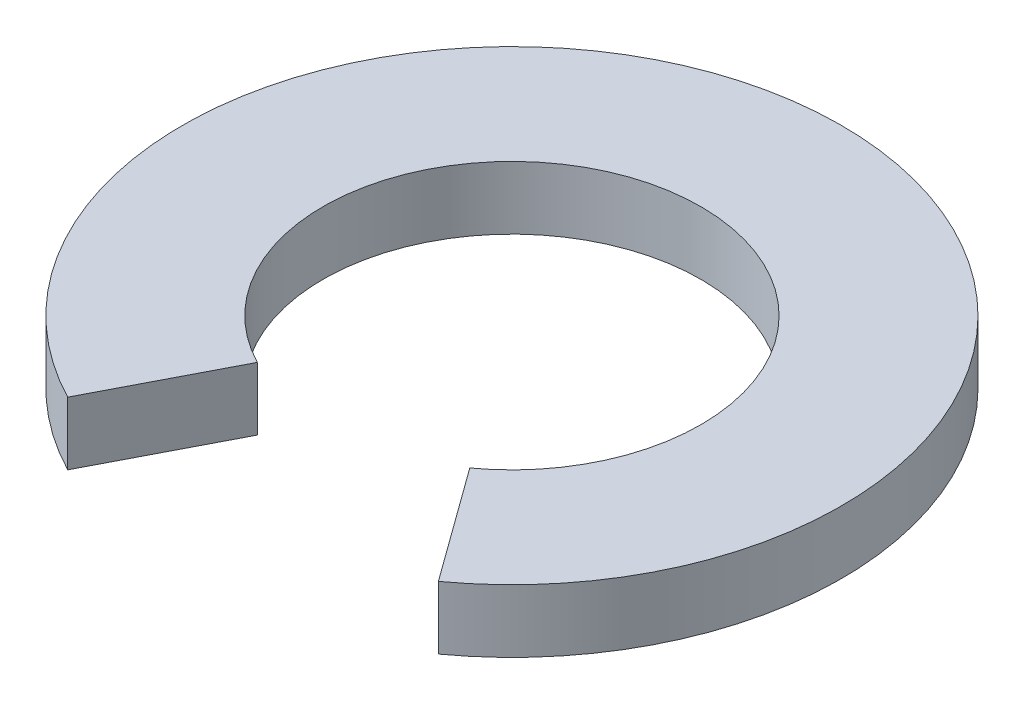
ISO-10303-21;
HEADER;
FILE_DESCRIPTION(('STEP AP214'),'2;1');
FILE_NAME('part.step','',(''),(''),'','','');
FILE_SCHEMA(('AUTOMOTIVE_DESIGN { 1 0 10303 214 1 1 1 1 }'));
ENDSEC;
DATA;
#1=APPLICATION_CONTEXT('core data for automotive mechanical design processes');
#2=APPLICATION_PROTOCOL_DEFINITION('international standard','automotive_design',2000,#1);
#3=PRODUCT_CONTEXT('',#1,'mechanical');
#4=PRODUCT('Part','Part','',(#3));
#5=PRODUCT_RELATED_PRODUCT_CATEGORY('part','',(#4));
#6=PRODUCT_DEFINITION_FORMATION('','',#4);
#7=PRODUCT_DEFINITION_CONTEXT('part definition',#1,'design');
#8=PRODUCT_DEFINITION('design','',#6,#7);
#9=PRODUCT_DEFINITION_SHAPE('','',#8);
#10=(LENGTH_UNIT() NAMED_UNIT(*) SI_UNIT(.MILLI.,.METRE.));
#11=(NAMED_UNIT(*) PLANE_ANGLE_UNIT() SI_UNIT($,.RADIAN.));
#12=(NAMED_UNIT(*) SI_UNIT($,.STERADIAN.) SOLID_ANGLE_UNIT());
#13=UNCERTAINTY_MEASURE_WITH_UNIT(LENGTH_MEASURE(1.E-05),#10,'distance_accuracy_value','');
#14=(GEOMETRIC_REPRESENTATION_CONTEXT(3) GLOBAL_UNCERTAINTY_ASSIGNED_CONTEXT((#13)) GLOBAL_UNIT_ASSIGNED_CONTEXT((#10,
#11,#12)) REPRESENTATION_CONTEXT('',''));
#15=CARTESIAN_POINT('',(0.,0.,0.));
#16=DIRECTION('',(0.,0.,1.));
#17=DIRECTION('',(1.,0.,0.));
#18=AXIS2_PLACEMENT_3D('',#15,#16,#17);
#19=CARTESIAN_POINT('',(0.,0.5,0.));
#20=DIRECTION('',(0.,-1.,0.));
#21=DIRECTION('',(0.,0.,-1.));
#22=AXIS2_PLACEMENT_3D('',#19,#20,#21);
#23=CYLINDRICAL_SURFACE('',#22,1.5);
#24=CARTESIAN_POINT('',(0.,0.,0.));
#25=DIRECTION('',(0.,1.,0.));
#26=DIRECTION('',(0.,0.,1.));
#27=AXIS2_PLACEMENT_3D('',#24,#25,#26);
#28=CIRCLE('',#27,1.5);
#29=CARTESIAN_POINT('',(0.880018763291368,0.,1.21472917815253));
#30=VERTEX_POINT('',#29);
#31=CARTESIAN_POINT('',(-0.689688132571273,0.,1.33203989421877));
#32=VERTEX_POINT('',#31);
#33=EDGE_CURVE('E97',#30,#32,#28,.T.);
#34=ORIENTED_EDGE('',*,*,#33,.F.);
#35=DIRECTION('',(0.,-1.,0.));
#36=VECTOR('',#35,1.);
#37=CARTESIAN_POINT('',(0.880018763291368,0.5,1.21472917815253));
#38=LINE('',#37,#36);
#39=CARTESIAN_POINT('',(0.880018763291368,0.5,1.21472917815253));
#40=VERTEX_POINT('',#39);
#41=EDGE_CURVE('E11',#40,#30,#38,.T.);
#42=ORIENTED_EDGE('',*,*,#41,.F.);
#43=CARTESIAN_POINT('',(0.,0.5,0.));
#44=DIRECTION('',(0.,1.,0.));
#45=DIRECTION('',(0.,0.,1.));
#46=AXIS2_PLACEMENT_3D('',#43,#44,#45);
#47=CIRCLE('',#46,1.5);
#48=CARTESIAN_POINT('',(-0.689688132571273,0.5,1.33203989421877));
#49=VERTEX_POINT('',#48);
#50=EDGE_CURVE('E91',#40,#49,#47,.T.);
#51=ORIENTED_EDGE('',*,*,#50,.T.);
#52=DIRECTION('',(0.,-1.,0.));
#53=VECTOR('',#52,1.);
#54=CARTESIAN_POINT('',(-0.689688132571273,0.5,1.33203989421877));
#55=LINE('',#54,#53);
#56=EDGE_CURVE('E72',#49,#32,#55,.T.);
#57=ORIENTED_EDGE('',*,*,#56,.T.);
#58=EDGE_LOOP('',(#34,#42,#51,#57));
#59=FACE_BOUND('',#58,.T.);
#60=ADVANCED_FACE('F34',(#59),#23,.F.);
#61=CARTESIAN_POINT('',(0.,0.5,0.));
#62=DIRECTION('',(-0.809819452101689,0.,0.586679175527579));
#63=DIRECTION('',(0.586679175527579,0.,0.809819452101689));
#64=AXIS2_PLACEMENT_3D('',#61,#62,#63);
#65=PLANE('',#64);
#66=DIRECTION('',(-0.586679175527579,0.,-0.809819452101689));
#67=VECTOR('',#66,1.);
#68=CARTESIAN_POINT('',(0.,0.,0.));
#69=LINE('',#68,#67);
#70=CARTESIAN_POINT('',(1.53511935147968,0.,2.11899376010414));
#71=VERTEX_POINT('',#70);
#72=EDGE_CURVE('E85',#71,#30,#69,.T.);
#73=ORIENTED_EDGE('',*,*,#72,.F.);
#74=DIRECTION('',(0.,-1.,0.));
#75=VECTOR('',#74,1.);
#76=CARTESIAN_POINT('',(1.53511935147968,0.5,2.11899376010414));
#77=LINE('',#76,#75);
#78=CARTESIAN_POINT('',(1.53511935147968,0.5,2.11899376010414));
#79=VERTEX_POINT('',#78);
#80=EDGE_CURVE('E42',#79,#71,#77,.T.);
#81=ORIENTED_EDGE('',*,*,#80,.F.);
#82=DIRECTION('',(-0.586679175527579,0.,-0.809819452101689));
#83=VECTOR('',#82,1.);
#84=CARTESIAN_POINT('',(0.,0.5,0.));
#85=LINE('',#84,#83);
#86=EDGE_CURVE('E83',#79,#40,#85,.T.);
#87=ORIENTED_EDGE('',*,*,#86,.T.);
#88=ORIENTED_EDGE('',*,*,#41,.T.);
#89=EDGE_LOOP('',(#73,#81,#87,#88));
#90=FACE_BOUND('',#89,.T.);
#91=ADVANCED_FACE('F81',(#90),#65,.T.);
#92=CARTESIAN_POINT('',(0.,0.5,0.));
#93=DIRECTION('',(0.,-1.,0.));
#94=DIRECTION('',(0.,0.,-1.));
#95=AXIS2_PLACEMENT_3D('',#92,#93,#94);
#96=CYLINDRICAL_SURFACE('',#95,2.61662492127696);
#97=CARTESIAN_POINT('',(0.,0.,0.));
#98=DIRECTION('',(0.,1.,0.));
#99=DIRECTION('',(0.,0.,1.));
#100=AXIS2_PLACEMENT_3D('',#97,#98,#99);
#101=CIRCLE('',#100,2.61662492127696);
#102=CARTESIAN_POINT('',(-1.20310343706331,0.,2.32363252223197));
#103=VERTEX_POINT('',#102);
#104=EDGE_CURVE('E65',#71,#103,#101,.T.);
#105=ORIENTED_EDGE('',*,*,#104,.T.);
#106=DIRECTION('',(0.,-1.,0.));
#107=VECTOR('',#106,1.);
#108=CARTESIAN_POINT('',(-1.20310343706331,0.5,2.32363252223197));
#109=LINE('',#108,#107);
#110=CARTESIAN_POINT('',(-1.20310343706331,0.5,2.32363252223197));
#111=VERTEX_POINT('',#110);
#112=EDGE_CURVE('E86',#111,#103,#109,.T.);
#113=ORIENTED_EDGE('',*,*,#112,.F.);
#114=CARTESIAN_POINT('',(0.,0.5,0.));
#115=DIRECTION('',(0.,1.,0.));
#116=DIRECTION('',(0.,0.,1.));
#117=AXIS2_PLACEMENT_3D('',#114,#115,#116);
#118=CIRCLE('',#117,2.61662492127696);
#119=EDGE_CURVE('E87',#79,#111,#118,.T.);
#120=ORIENTED_EDGE('',*,*,#119,.F.);
#121=ORIENTED_EDGE('',*,*,#80,.T.);
#122=EDGE_LOOP('',(#105,#113,#120,#121));
#123=FACE_BOUND('',#122,.T.);
#124=ADVANCED_FACE('F88',(#123),#96,.T.);
#125=CARTESIAN_POINT('',(0.,0.5,0.));
#126=DIRECTION('',(-0.888026596145846,0.,-0.459792088380848));
#127=DIRECTION('',(-0.459792088380848,0.,0.888026596145846));
#128=AXIS2_PLACEMENT_3D('',#125,#126,#127);
#129=PLANE('',#128);
#130=DIRECTION('',(0.459792088380848,0.,-0.888026596145846));
#131=VECTOR('',#130,1.);
#132=CARTESIAN_POINT('',(0.,0.,0.));
#133=LINE('',#132,#131);
#134=EDGE_CURVE('E93',#103,#32,#133,.T.);
#135=ORIENTED_EDGE('',*,*,#134,.T.);
#136=ORIENTED_EDGE('',*,*,#56,.F.);
#137=DIRECTION('',(0.459792088380848,0.,-0.888026596145846));
#138=VECTOR('',#137,1.);
#139=CARTESIAN_POINT('',(0.,0.5,0.));
#140=LINE('',#139,#138);
#141=EDGE_CURVE('E50',#111,#49,#140,.T.);
#142=ORIENTED_EDGE('',*,*,#141,.F.);
#143=ORIENTED_EDGE('',*,*,#112,.T.);
#144=EDGE_LOOP('',(#135,#136,#142,#143));
#145=FACE_BOUND('',#144,.T.);
#146=ADVANCED_FACE('F106',(#145),#129,.F.);
#147=CARTESIAN_POINT('',(0.,0.5,0.));
#148=DIRECTION('',(0.,1.,0.));
#149=DIRECTION('',(0.,0.,1.));
#150=AXIS2_PLACEMENT_3D('',#147,#148,#149);
#151=PLANE('',#150);
#152=ORIENTED_EDGE('',*,*,#50,.F.);
#153=ORIENTED_EDGE('',*,*,#86,.F.);
#154=ORIENTED_EDGE('',*,*,#119,.T.);
#155=ORIENTED_EDGE('',*,*,#141,.T.);
#156=EDGE_LOOP('',(#152,#153,#154,#155));
#157=FACE_BOUND('',#156,.T.);
#158=ADVANCED_FACE('F90',(#157),#151,.T.);
#159=CARTESIAN_POINT('',(0.,0.,0.));
#160=DIRECTION('',(0.,1.,0.));
#161=DIRECTION('',(0.,0.,1.));
#162=AXIS2_PLACEMENT_3D('',#159,#160,#161);
#163=PLANE('',#162);
#164=ORIENTED_EDGE('',*,*,#33,.T.);
#165=ORIENTED_EDGE('',*,*,#134,.F.);
#166=ORIENTED_EDGE('',*,*,#104,.F.);
#167=ORIENTED_EDGE('',*,*,#72,.T.);
#168=EDGE_LOOP('',(#164,#165,#166,#167));
#169=FACE_BOUND('',#168,.T.);
#170=ADVANCED_FACE('F108',(#169),#163,.F.);
#171=CLOSED_SHELL('',(#60,#91,#124,#146,#158,#170));
#172=MANIFOLD_SOLID_BREP('B2',#171);
#173=ADVANCED_BREP_SHAPE_REPRESENTATION('',(#18,#172),#14);
#174=SHAPE_DEFINITION_REPRESENTATION(#9,#173);
ENDSEC;
END-ISO-10303-21;
